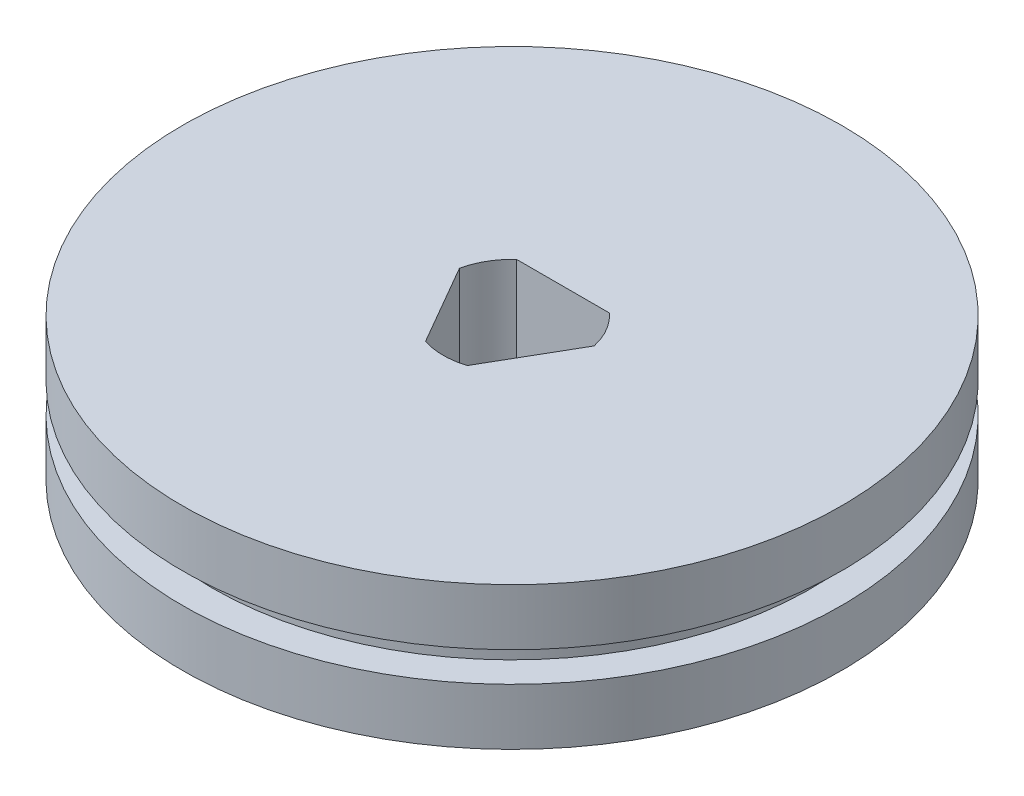
ISO-10303-21;
HEADER;
FILE_DESCRIPTION(('STEP AP214'),'2;1');
FILE_NAME('part.step','',(''),(''),'','','');
FILE_SCHEMA(('AUTOMOTIVE_DESIGN { 1 0 10303 214 1 1 1 1 }'));
ENDSEC;
DATA;
#1=APPLICATION_CONTEXT('core data for automotive mechanical design processes');
#2=APPLICATION_PROTOCOL_DEFINITION('international standard','automotive_design',2000,#1);
#3=PRODUCT_CONTEXT('',#1,'mechanical');
#4=PRODUCT('Part','Part','',(#3));
#5=PRODUCT_RELATED_PRODUCT_CATEGORY('part','',(#4));
#6=PRODUCT_DEFINITION_FORMATION('','',#4);
#7=PRODUCT_DEFINITION_CONTEXT('part definition',#1,'design');
#8=PRODUCT_DEFINITION('design','',#6,#7);
#9=PRODUCT_DEFINITION_SHAPE('','',#8);
#10=(LENGTH_UNIT() NAMED_UNIT(*) SI_UNIT(.MILLI.,.METRE.));
#11=(NAMED_UNIT(*) PLANE_ANGLE_UNIT() SI_UNIT($,.RADIAN.));
#12=(NAMED_UNIT(*) SI_UNIT($,.STERADIAN.) SOLID_ANGLE_UNIT());
#13=UNCERTAINTY_MEASURE_WITH_UNIT(LENGTH_MEASURE(1.E-05),#10,'distance_accuracy_value','');
#14=(GEOMETRIC_REPRESENTATION_CONTEXT(3) GLOBAL_UNCERTAINTY_ASSIGNED_CONTEXT((#13)) GLOBAL_UNIT_ASSIGNED_CONTEXT((#10,
#11,#12)) REPRESENTATION_CONTEXT('',''));
#15=CARTESIAN_POINT('',(0.,0.,0.));
#16=DIRECTION('',(0.,0.,1.));
#17=DIRECTION('',(1.,0.,0.));
#18=AXIS2_PLACEMENT_3D('',#15,#16,#17);
#19=CARTESIAN_POINT('',(0.,2.38125,0.));
#20=DIRECTION('',(0.,-1.,0.));
#21=DIRECTION('',(0.,0.,-1.));
#22=AXIS2_PLACEMENT_3D('',#19,#20,#21);
#23=CYLINDRICAL_SURFACE('',#22,11.);
#24=CARTESIAN_POINT('',(0.,-2.38125,0.));
#25=DIRECTION('',(0.,1.,0.));
#26=DIRECTION('',(0.,0.,1.));
#27=AXIS2_PLACEMENT_3D('',#24,#25,#26);
#28=CIRCLE('',#27,11.);
#29=CARTESIAN_POINT('',(0.,-2.38125,-11.));
#30=VERTEX_POINT('',#29);
#31=EDGE_CURVE('E41',#30,#30,#28,.T.);
#32=CARTESIAN_POINT('',(0.,-0.5,0.));
#33=DIRECTION('',(0.,1.,0.));
#34=DIRECTION('',(0.,0.,1.));
#35=AXIS2_PLACEMENT_3D('',#32,#33,#34);
#36=CIRCLE('',#35,11.);
#37=CARTESIAN_POINT('',(0.,-0.5,-11.));
#38=VERTEX_POINT('',#37);
#39=EDGE_CURVE('E149',#38,#38,#36,.T.);
#40=CARTESIAN_POINT('',(0.,-2.38125,-11.));
#41=CARTESIAN_POINT('',(0.,-2.36165364583333,-11.));
#42=CARTESIAN_POINT('',(0.,-2.34205729166667,-11.));
#43=CARTESIAN_POINT('',(0.,-2.30286458333333,-11.));
#44=CARTESIAN_POINT('',(0.,-2.28326822916667,-11.));
#45=CARTESIAN_POINT('',(0.,-2.24407552083333,-11.));
#46=CARTESIAN_POINT('',(0.,-2.22447916666667,-11.));
#47=CARTESIAN_POINT('',(0.,-2.18528645833333,-11.));
#48=CARTESIAN_POINT('',(0.,-2.16569010416667,-11.));
#49=CARTESIAN_POINT('',(0.,-2.12649739583333,-11.));
#50=CARTESIAN_POINT('',(0.,-2.10690104166667,-11.));
#51=CARTESIAN_POINT('',(0.,-2.06770833333333,-11.));
#52=CARTESIAN_POINT('',(0.,-2.04811197916667,-11.));
#53=CARTESIAN_POINT('',(0.,-2.00891927083333,-11.));
#54=CARTESIAN_POINT('',(0.,-1.98932291666667,-11.));
#55=CARTESIAN_POINT('',(0.,-1.95013020833333,-11.));
#56=CARTESIAN_POINT('',(0.,-1.93053385416667,-11.));
#57=CARTESIAN_POINT('',(0.,-1.89134114583333,-11.));
#58=CARTESIAN_POINT('',(0.,-1.87174479166667,-11.));
#59=CARTESIAN_POINT('',(0.,-1.83255208333333,-11.));
#60=CARTESIAN_POINT('',(0.,-1.81295572916667,-11.));
#61=CARTESIAN_POINT('',(0.,-1.77376302083333,-11.));
#62=CARTESIAN_POINT('',(0.,-1.75416666666667,-11.));
#63=CARTESIAN_POINT('',(0.,-1.71497395833333,-11.));
#64=CARTESIAN_POINT('',(0.,-1.69537760416667,-11.));
#65=CARTESIAN_POINT('',(0.,-1.65618489583333,-11.));
#66=CARTESIAN_POINT('',(0.,-1.63658854166667,-11.));
#67=CARTESIAN_POINT('',(0.,-1.59739583333333,-11.));
#68=CARTESIAN_POINT('',(0.,-1.57779947916667,-11.));
#69=CARTESIAN_POINT('',(0.,-1.53860677083333,-11.));
#70=CARTESIAN_POINT('',(0.,-1.51901041666667,-11.));
#71=CARTESIAN_POINT('',(0.,-1.47981770833333,-11.));
#72=CARTESIAN_POINT('',(0.,-1.46022135416667,-11.));
#73=CARTESIAN_POINT('',(0.,-1.42102864583333,-11.));
#74=CARTESIAN_POINT('',(0.,-1.40143229166667,-11.));
#75=CARTESIAN_POINT('',(0.,-1.36223958333333,-11.));
#76=CARTESIAN_POINT('',(0.,-1.34264322916667,-11.));
#77=CARTESIAN_POINT('',(0.,-1.30345052083333,-11.));
#78=CARTESIAN_POINT('',(0.,-1.28385416666667,-11.));
#79=CARTESIAN_POINT('',(0.,-1.24466145833333,-11.));
#80=CARTESIAN_POINT('',(0.,-1.22506510416667,-11.));
#81=CARTESIAN_POINT('',(0.,-1.18587239583333,-11.));
#82=CARTESIAN_POINT('',(0.,-1.16627604166667,-11.));
#83=CARTESIAN_POINT('',(0.,-1.12708333333333,-11.));
#84=CARTESIAN_POINT('',(0.,-1.10748697916667,-11.));
#85=CARTESIAN_POINT('',(0.,-1.06829427083333,-11.));
#86=CARTESIAN_POINT('',(0.,-1.04869791666667,-11.));
#87=CARTESIAN_POINT('',(0.,-1.00950520833333,-11.));
#88=CARTESIAN_POINT('',(0.,-0.989908854166667,-11.));
#89=CARTESIAN_POINT('',(0.,-0.950716145833334,-11.));
#90=CARTESIAN_POINT('',(0.,-0.931119791666667,-11.));
#91=CARTESIAN_POINT('',(0.,-0.891927083333334,-11.));
#92=CARTESIAN_POINT('',(0.,-0.872330729166667,-11.));
#93=CARTESIAN_POINT('',(0.,-0.833138020833334,-11.));
#94=CARTESIAN_POINT('',(0.,-0.813541666666667,-11.));
#95=CARTESIAN_POINT('',(0.,-0.774348958333334,-11.));
#96=CARTESIAN_POINT('',(0.,-0.754752604166667,-11.));
#97=CARTESIAN_POINT('',(0.,-0.715559895833334,-11.));
#98=CARTESIAN_POINT('',(0.,-0.695963541666667,-11.));
#99=CARTESIAN_POINT('',(0.,-0.656770833333334,-11.));
#100=CARTESIAN_POINT('',(0.,-0.637174479166667,-11.));
#101=CARTESIAN_POINT('',(0.,-0.597981770833334,-11.));
#102=CARTESIAN_POINT('',(0.,-0.578385416666667,-11.));
#103=CARTESIAN_POINT('',(0.,-0.539192708333334,-11.));
#104=CARTESIAN_POINT('',(0.,-0.519596354166667,-11.));
#105=CARTESIAN_POINT('',(0.,-0.5,-11.));
#106=B_SPLINE_CURVE_WITH_KNOTS('',3,(#40,#41,#42,#43,#44,#45,#46,#47,#48,#49,#50,#51,#52,#53,
#54,#55,#56,#57,#58,#59,#60,#61,#62,#63,#64,#65,#66,#67,#68,#69,#70,#71,#72,#73,#74,#75,#76,#77,
#78,#79,#80,#81,#82,#83,#84,#85,#86,#87,#88,#89,#90,#91,#92,#93,#94,#95,#96,#97,#98,#99,#100,
#101,#102,#103,#104,#105),.UNSPECIFIED.,.F.,.F.,(4,2,2,2,2,2,2,2,2,2,2,2,2,2,2,2,2,2,2,2,2,2,2,
2,2,2,2,2,2,2,2,2,4),(0.,0.0587890625,0.117578125,0.1763671875,0.23515625,0.2939453125,
0.352734375,0.4115234375,0.4703125,0.5291015625,0.587890625,0.6466796875,0.70546875,
0.7642578125,0.823046875,0.8818359375,0.940625,0.9994140625,1.058203125,1.1169921875,1.17578125,
1.2345703125,1.293359375,1.3521484375,1.4109375,1.4697265625,1.528515625,1.5873046875,
1.64609375,1.7048828125,1.763671875,1.8224609375,1.88125),.UNSPECIFIED.);
#107=EDGE_CURVE('BSEAM37',#30,#38,#106,.T.);
#108=ORIENTED_EDGE('',*,*,#31,.T.);
#109=ORIENTED_EDGE('',*,*,#39,.F.);
#110=ORIENTED_EDGE('',*,*,#107,.T.);
#111=ORIENTED_EDGE('',*,*,#107,.F.);
#112=EDGE_LOOP('',(#108,#110,#109,#111));
#113=FACE_BOUND('',#112,.T.);
#114=ADVANCED_FACE('F37',(#113),#23,.T.);
#115=CARTESIAN_POINT('',(0.,-2.38125,0.));
#116=DIRECTION('',(0.,1.,0.));
#117=DIRECTION('',(0.,0.,1.));
#118=AXIS2_PLACEMENT_3D('',#115,#116,#117);
#119=PLANE('',#118);
#120=DIRECTION('',(-1.,0.,0.));
#121=VECTOR('',#120,1.);
#122=CARTESIAN_POINT('',(1.54919333848297,-2.38125,-1.7));
#123=LINE('',#122,#121);
#124=CARTESIAN_POINT('',(1.54919333848297,-2.38125,-1.7));
#125=VERTEX_POINT('',#124);
#126=CARTESIAN_POINT('',(-1.54919333848297,-2.38125,-1.7));
#127=VERTEX_POINT('',#126);
#128=EDGE_CURVE('E98',#125,#127,#123,.T.);
#129=ORIENTED_EDGE('',*,*,#128,.T.);
#130=CARTESIAN_POINT('',(0.,-2.38125,0.));
#131=DIRECTION('',(0.,1.,0.));
#132=DIRECTION('',(0.,0.,1.));
#133=AXIS2_PLACEMENT_3D('',#130,#131,#132);
#134=CIRCLE('',#133,2.3);
#135=CARTESIAN_POINT('',(-2.24683985567503,-2.38125,-0.491640786499874));
#136=VERTEX_POINT('',#135);
#137=EDGE_CURVE('E92',#127,#136,#134,.T.);
#138=ORIENTED_EDGE('',*,*,#137,.T.);
#139=DIRECTION('',(0.5,0.,0.866025403784439));
#140=VECTOR('',#139,1.);
#141=CARTESIAN_POINT('',(-2.24683985567503,-2.38125,-0.491640786499874));
#142=LINE('',#141,#140);
#143=CARTESIAN_POINT('',(-0.697646517192063,-2.38125,2.19164078649987));
#144=VERTEX_POINT('',#143);
#145=EDGE_CURVE('E101',#136,#144,#142,.T.);
#146=ORIENTED_EDGE('',*,*,#145,.T.);
#147=CARTESIAN_POINT('',(0.,-2.38125,0.));
#148=DIRECTION('',(0.,1.,0.));
#149=DIRECTION('',(0.,0.,1.));
#150=AXIS2_PLACEMENT_3D('',#147,#148,#149);
#151=CIRCLE('',#150,2.3);
#152=CARTESIAN_POINT('',(0.697646517192063,-2.38125,2.19164078649987));
#153=VERTEX_POINT('',#152);
#154=EDGE_CURVE('E52',#144,#153,#151,.T.);
#155=ORIENTED_EDGE('',*,*,#154,.T.);
#156=DIRECTION('',(0.500000000000001,0.,-0.866025403784438));
#157=VECTOR('',#156,1.);
#158=CARTESIAN_POINT('',(0.697646517192063,-2.38125,2.19164078649987));
#159=LINE('',#158,#157);
#160=CARTESIAN_POINT('',(2.24683985567503,-2.38125,-0.491640786499873));
#161=VERTEX_POINT('',#160);
#162=EDGE_CURVE('E116',#153,#161,#159,.T.);
#163=ORIENTED_EDGE('',*,*,#162,.T.);
#164=CARTESIAN_POINT('',(0.,-2.38125,0.));
#165=DIRECTION('',(0.,1.,0.));
#166=DIRECTION('',(0.,0.,-1.));
#167=AXIS2_PLACEMENT_3D('',#164,#165,#166);
#168=CIRCLE('',#167,2.3);
#169=EDGE_CURVE('E119',#161,#125,#168,.T.);
#170=ORIENTED_EDGE('',*,*,#169,.T.);
#171=EDGE_LOOP('',(#129,#138,#146,#155,#163,#170));
#172=FACE_BOUND('',#171,.T.);
#173=ORIENTED_EDGE('',*,*,#31,.F.);
#174=EDGE_LOOP('',(#173));
#175=FACE_BOUND('',#174,.T.);
#176=ADVANCED_FACE('F105',(#172,#175),#119,.F.);
#177=CARTESIAN_POINT('',(0.,-0.5,0.));
#178=DIRECTION('',(0.,1.,0.));
#179=DIRECTION('',(0.,0.,1.));
#180=AXIS2_PLACEMENT_3D('',#177,#178,#179);
#181=PLANE('',#180);
#182=CARTESIAN_POINT('',(0.,-0.5,0.));
#183=DIRECTION('',(0.,1.,0.));
#184=DIRECTION('',(0.,0.,1.));
#185=AXIS2_PLACEMENT_3D('',#182,#183,#184);
#186=CIRCLE('',#185,10.);
#187=CARTESIAN_POINT('',(0.,-0.5,10.));
#188=VERTEX_POINT('',#187);
#189=EDGE_CURVE('E143',#188,#188,#186,.T.);
#190=ORIENTED_EDGE('',*,*,#189,.F.);
#191=EDGE_LOOP('',(#190));
#192=FACE_BOUND('',#191,.T.);
#193=ORIENTED_EDGE('',*,*,#39,.T.);
#194=EDGE_LOOP('',(#193));
#195=FACE_BOUND('',#194,.T.);
#196=ADVANCED_FACE('F160',(#192,#195),#181,.T.);
#197=CARTESIAN_POINT('',(0.,0.5,0.));
#198=DIRECTION('',(0.,1.,0.));
#199=DIRECTION('',(0.,0.,1.));
#200=AXIS2_PLACEMENT_3D('',#197,#198,#199);
#201=PLANE('',#200);
#202=CARTESIAN_POINT('',(0.,0.5,0.));
#203=DIRECTION('',(0.,1.,0.));
#204=DIRECTION('',(0.,0.,1.));
#205=AXIS2_PLACEMENT_3D('',#202,#203,#204);
#206=CIRCLE('',#205,10.);
#207=CARTESIAN_POINT('',(0.,0.5,10.));
#208=VERTEX_POINT('',#207);
#209=EDGE_CURVE('E135',#208,#208,#206,.T.);
#210=ORIENTED_EDGE('',*,*,#209,.T.);
#211=EDGE_LOOP('',(#210));
#212=FACE_BOUND('',#211,.T.);
#213=CARTESIAN_POINT('',(0.,0.5,0.));
#214=DIRECTION('',(0.,1.,0.));
#215=DIRECTION('',(0.,0.,1.));
#216=AXIS2_PLACEMENT_3D('',#213,#214,#215);
#217=CIRCLE('',#216,11.);
#218=CARTESIAN_POINT('',(0.,0.5,-11.));
#219=VERTEX_POINT('',#218);
#220=EDGE_CURVE('E146',#219,#219,#217,.T.);
#221=ORIENTED_EDGE('',*,*,#220,.F.);
#222=EDGE_LOOP('',(#221));
#223=FACE_BOUND('',#222,.T.);
#224=ADVANCED_FACE('F157',(#212,#223),#201,.F.);
#225=CARTESIAN_POINT('',(0.,-0.5,0.));
#226=DIRECTION('',(0.,1.,0.));
#227=DIRECTION('',(0.,0.,1.));
#228=AXIS2_PLACEMENT_3D('',#225,#226,#227);
#229=CYLINDRICAL_SURFACE('',#228,10.);
#230=ORIENTED_EDGE('',*,*,#189,.T.);
#231=EDGE_LOOP('',(#230));
#232=FACE_BOUND('',#231,.T.);
#233=ORIENTED_EDGE('',*,*,#209,.F.);
#234=EDGE_LOOP('',(#233));
#235=FACE_BOUND('',#234,.T.);
#236=ADVANCED_FACE('F159',(#232,#235),#229,.T.);
#237=CARTESIAN_POINT('',(0.,2.38125,0.));
#238=DIRECTION('',(0.,1.,0.));
#239=DIRECTION('',(0.,0.,1.));
#240=AXIS2_PLACEMENT_3D('',#237,#238,#239);
#241=PLANE('',#240);
#242=CARTESIAN_POINT('',(0.,2.38125,0.));
#243=DIRECTION('',(0.,1.,0.));
#244=DIRECTION('',(0.,0.,1.));
#245=AXIS2_PLACEMENT_3D('',#242,#243,#244);
#246=CIRCLE('',#245,2.3);
#247=CARTESIAN_POINT('',(-1.54919333848297,2.38125,-1.7));
#248=VERTEX_POINT('',#247);
#249=CARTESIAN_POINT('',(-2.24683985567503,2.38125,-0.491640786499874));
#250=VERTEX_POINT('',#249);
#251=EDGE_CURVE('E60',#248,#250,#246,.T.);
#252=ORIENTED_EDGE('',*,*,#251,.F.);
#253=DIRECTION('',(-1.,0.,0.));
#254=VECTOR('',#253,1.);
#255=CARTESIAN_POINT('',(1.54919333848297,2.38125,-1.7));
#256=LINE('',#255,#254);
#257=CARTESIAN_POINT('',(1.54919333848297,2.38125,-1.7));
#258=VERTEX_POINT('',#257);
#259=EDGE_CURVE('E109',#258,#248,#256,.T.);
#260=ORIENTED_EDGE('',*,*,#259,.F.);
#261=CARTESIAN_POINT('',(0.,2.38125,0.));
#262=DIRECTION('',(0.,1.,0.));
#263=DIRECTION('',(0.,0.,-1.));
#264=AXIS2_PLACEMENT_3D('',#261,#262,#263);
#265=CIRCLE('',#264,2.3);
#266=CARTESIAN_POINT('',(2.24683985567503,2.38125,-0.491640786499873));
#267=VERTEX_POINT('',#266);
#268=EDGE_CURVE('E112',#267,#258,#265,.T.);
#269=ORIENTED_EDGE('',*,*,#268,.F.);
#270=DIRECTION('',(0.500000000000001,0.,-0.866025403784438));
#271=VECTOR('',#270,1.);
#272=CARTESIAN_POINT('',(0.697646517192063,2.38125,2.19164078649987));
#273=LINE('',#272,#271);
#274=CARTESIAN_POINT('',(0.697646517192063,2.38125,2.19164078649987));
#275=VERTEX_POINT('',#274);
#276=EDGE_CURVE('E128',#275,#267,#273,.T.);
#277=ORIENTED_EDGE('',*,*,#276,.F.);
#278=CARTESIAN_POINT('',(0.,2.38125,0.));
#279=DIRECTION('',(0.,1.,0.));
#280=DIRECTION('',(0.,0.,1.));
#281=AXIS2_PLACEMENT_3D('',#278,#279,#280);
#282=CIRCLE('',#281,2.3);
#283=CARTESIAN_POINT('',(-0.697646517192063,2.38125,2.19164078649987));
#284=VERTEX_POINT('',#283);
#285=EDGE_CURVE('E125',#284,#275,#282,.T.);
#286=ORIENTED_EDGE('',*,*,#285,.F.);
#287=DIRECTION('',(0.5,0.,0.866025403784439));
#288=VECTOR('',#287,1.);
#289=CARTESIAN_POINT('',(-2.24683985567503,2.38125,-0.491640786499874));
#290=LINE('',#289,#288);
#291=EDGE_CURVE('E123',#250,#284,#290,.T.);
#292=ORIENTED_EDGE('',*,*,#291,.F.);
#293=EDGE_LOOP('',(#252,#260,#269,#277,#286,#292));
#294=FACE_BOUND('',#293,.T.);
#295=CARTESIAN_POINT('',(0.,2.38125,0.));
#296=DIRECTION('',(0.,1.,0.));
#297=DIRECTION('',(0.,0.,1.));
#298=AXIS2_PLACEMENT_3D('',#295,#296,#297);
#299=CIRCLE('',#298,11.);
#300=CARTESIAN_POINT('',(0.,2.38125,-11.));
#301=VERTEX_POINT('',#300);
#302=EDGE_CURVE('E11',#301,#301,#299,.T.);
#303=ORIENTED_EDGE('',*,*,#302,.T.);
#304=EDGE_LOOP('',(#303));
#305=FACE_BOUND('',#304,.T.);
#306=ADVANCED_FACE('F167',(#294,#305),#241,.T.);
#307=CARTESIAN_POINT('',(0.,0.5,-11.));
#308=CARTESIAN_POINT('',(0.,0.519596354166666,-11.));
#309=CARTESIAN_POINT('',(0.,0.539192708333333,-11.));
#310=CARTESIAN_POINT('',(0.,0.578385416666667,-11.));
#311=CARTESIAN_POINT('',(0.,0.597981770833333,-11.));
#312=CARTESIAN_POINT('',(0.,0.637174479166667,-11.));
#313=CARTESIAN_POINT('',(0.,0.656770833333333,-11.));
#314=CARTESIAN_POINT('',(0.,0.695963541666667,-11.));
#315=CARTESIAN_POINT('',(0.,0.715559895833333,-11.));
#316=CARTESIAN_POINT('',(0.,0.754752604166667,-11.));
#317=CARTESIAN_POINT('',(0.,0.774348958333333,-11.));
#318=CARTESIAN_POINT('',(0.,0.813541666666667,-11.));
#319=CARTESIAN_POINT('',(0.,0.833138020833333,-11.));
#320=CARTESIAN_POINT('',(0.,0.872330729166667,-11.));
#321=CARTESIAN_POINT('',(0.,0.891927083333333,-11.));
#322=CARTESIAN_POINT('',(0.,0.931119791666666,-11.));
#323=CARTESIAN_POINT('',(0.,0.950716145833333,-11.));
#324=CARTESIAN_POINT('',(0.,0.989908854166667,-11.));
#325=CARTESIAN_POINT('',(0.,1.00950520833333,-11.));
#326=CARTESIAN_POINT('',(0.,1.04869791666667,-11.));
#327=CARTESIAN_POINT('',(0.,1.06829427083333,-11.));
#328=CARTESIAN_POINT('',(0.,1.10748697916667,-11.));
#329=CARTESIAN_POINT('',(0.,1.12708333333333,-11.));
#330=CARTESIAN_POINT('',(0.,1.16627604166667,-11.));
#331=CARTESIAN_POINT('',(0.,1.18587239583333,-11.));
#332=CARTESIAN_POINT('',(0.,1.22506510416667,-11.));
#333=CARTESIAN_POINT('',(0.,1.24466145833333,-11.));
#334=CARTESIAN_POINT('',(0.,1.28385416666667,-11.));
#335=CARTESIAN_POINT('',(0.,1.30345052083333,-11.));
#336=CARTESIAN_POINT('',(0.,1.34264322916667,-11.));
#337=CARTESIAN_POINT('',(0.,1.36223958333333,-11.));
#338=CARTESIAN_POINT('',(0.,1.40143229166667,-11.));
#339=CARTESIAN_POINT('',(0.,1.42102864583333,-11.));
#340=CARTESIAN_POINT('',(0.,1.46022135416667,-11.));
#341=CARTESIAN_POINT('',(0.,1.47981770833333,-11.));
#342=CARTESIAN_POINT('',(0.,1.51901041666667,-11.));
#343=CARTESIAN_POINT('',(0.,1.53860677083333,-11.));
#344=CARTESIAN_POINT('',(0.,1.57779947916667,-11.));
#345=CARTESIAN_POINT('',(0.,1.59739583333333,-11.));
#346=CARTESIAN_POINT('',(0.,1.63658854166667,-11.));
#347=CARTESIAN_POINT('',(0.,1.65618489583333,-11.));
#348=CARTESIAN_POINT('',(0.,1.69537760416667,-11.));
#349=CARTESIAN_POINT('',(0.,1.71497395833333,-11.));
#350=CARTESIAN_POINT('',(0.,1.75416666666667,-11.));
#351=CARTESIAN_POINT('',(0.,1.77376302083333,-11.));
#352=CARTESIAN_POINT('',(0.,1.81295572916667,-11.));
#353=CARTESIAN_POINT('',(0.,1.83255208333333,-11.));
#354=CARTESIAN_POINT('',(0.,1.87174479166667,-11.));
#355=CARTESIAN_POINT('',(0.,1.89134114583333,-11.));
#356=CARTESIAN_POINT('',(0.,1.93053385416667,-11.));
#357=CARTESIAN_POINT('',(0.,1.95013020833333,-11.));
#358=CARTESIAN_POINT('',(0.,1.98932291666667,-11.));
#359=CARTESIAN_POINT('',(0.,2.00891927083333,-11.));
#360=CARTESIAN_POINT('',(0.,2.04811197916667,-11.));
#361=CARTESIAN_POINT('',(0.,2.06770833333333,-11.));
#362=CARTESIAN_POINT('',(0.,2.10690104166667,-11.));
#363=CARTESIAN_POINT('',(0.,2.12649739583333,-11.));
#364=CARTESIAN_POINT('',(0.,2.16569010416667,-11.));
#365=CARTESIAN_POINT('',(0.,2.18528645833333,-11.));
#366=CARTESIAN_POINT('',(0.,2.22447916666667,-11.));
#367=CARTESIAN_POINT('',(0.,2.24407552083333,-11.));
#368=CARTESIAN_POINT('',(0.,2.28326822916667,-11.));
#369=CARTESIAN_POINT('',(0.,2.30286458333333,-11.));
#370=CARTESIAN_POINT('',(0.,2.34205729166667,-11.));
#371=CARTESIAN_POINT('',(0.,2.36165364583333,-11.));
#372=CARTESIAN_POINT('',(0.,2.38125,-11.));
#373=B_SPLINE_CURVE_WITH_KNOTS('',3,(#307,#308,#309,#310,#311,#312,#313,#314,#315,#316,#317,
#318,#319,#320,#321,#322,#323,#324,#325,#326,#327,#328,#329,#330,#331,#332,#333,#334,#335,#336,
#337,#338,#339,#340,#341,#342,#343,#344,#345,#346,#347,#348,#349,#350,#351,#352,#353,#354,#355,
#356,#357,#358,#359,#360,#361,#362,#363,#364,#365,#366,#367,#368,#369,#370,#371,#372),
.UNSPECIFIED.,.F.,.F.,(4,2,2,2,2,2,2,2,2,2,2,2,2,2,2,2,2,2,2,2,2,2,2,2,2,2,2,2,2,2,2,2,4),(0.,
0.0587890625,0.117578125,0.1763671875,0.23515625,0.2939453125,0.352734375,0.4115234375,
0.4703125,0.5291015625,0.587890625,0.6466796875,0.70546875,0.7642578125,0.823046875,
0.8818359375,0.940625,0.9994140625,1.058203125,1.1169921875,1.17578125,1.2345703125,1.293359375,
1.3521484375,1.4109375,1.4697265625,1.528515625,1.5873046875,1.64609375,1.7048828125,
1.763671875,1.8224609375,1.88125),.UNSPECIFIED.);
#374=EDGE_CURVE('BSEAM39',#219,#301,#373,.T.);
#375=ORIENTED_EDGE('',*,*,#220,.T.);
#376=ORIENTED_EDGE('',*,*,#302,.F.);
#377=ORIENTED_EDGE('',*,*,#374,.T.);
#378=ORIENTED_EDGE('',*,*,#374,.F.);
#379=EDGE_LOOP('',(#375,#377,#376,#378));
#380=FACE_BOUND('',#379,.T.);
#381=ADVANCED_FACE('F39',(#380),#23,.T.);
#382=CARTESIAN_POINT('',(0.,-2.38125,0.));
#383=DIRECTION('',(0.,1.,0.));
#384=DIRECTION('',(0.,0.,1.));
#385=AXIS2_PLACEMENT_3D('',#382,#383,#384);
#386=CYLINDRICAL_SURFACE('',#385,2.3);
#387=ORIENTED_EDGE('',*,*,#251,.T.);
#388=DIRECTION('',(0.,1.,0.));
#389=VECTOR('',#388,1.);
#390=CARTESIAN_POINT('',(-2.24683985567503,-2.38125,-0.491640786499874));
#391=LINE('',#390,#389);
#392=EDGE_CURVE('E88',#136,#250,#391,.T.);
#393=ORIENTED_EDGE('',*,*,#392,.F.);
#394=ORIENTED_EDGE('',*,*,#137,.F.);
#395=DIRECTION('',(0.,1.,0.));
#396=VECTOR('',#395,1.);
#397=CARTESIAN_POINT('',(-1.54919333848297,-2.38125,-1.7));
#398=LINE('',#397,#396);
#399=EDGE_CURVE('E133',#127,#248,#398,.T.);
#400=ORIENTED_EDGE('',*,*,#399,.T.);
#401=EDGE_LOOP('',(#387,#393,#394,#400));
#402=FACE_BOUND('',#401,.T.);
#403=ADVANCED_FACE('F90',(#402),#386,.F.);
#404=CARTESIAN_POINT('',(1.54919333848297,-2.38125,-1.7));
#405=DIRECTION('',(0.,0.,-1.));
#406=DIRECTION('',(-1.,0.,0.));
#407=AXIS2_PLACEMENT_3D('',#404,#405,#406);
#408=PLANE('',#407);
#409=ORIENTED_EDGE('',*,*,#259,.T.);
#410=ORIENTED_EDGE('',*,*,#399,.F.);
#411=ORIENTED_EDGE('',*,*,#128,.F.);
#412=DIRECTION('',(0.,1.,0.));
#413=VECTOR('',#412,1.);
#414=CARTESIAN_POINT('',(1.54919333848297,-2.38125,-1.7));
#415=LINE('',#414,#413);
#416=EDGE_CURVE('E136',#125,#258,#415,.T.);
#417=ORIENTED_EDGE('',*,*,#416,.T.);
#418=EDGE_LOOP('',(#409,#410,#411,#417));
#419=FACE_BOUND('',#418,.T.);
#420=ADVANCED_FACE('F185',(#419),#408,.F.);
#421=CARTESIAN_POINT('',(0.,-2.38125,0.));
#422=DIRECTION('',(0.,1.,0.));
#423=DIRECTION('',(0.,0.,1.));
#424=AXIS2_PLACEMENT_3D('',#421,#422,#423);
#425=CYLINDRICAL_SURFACE('',#424,2.3);
#426=ORIENTED_EDGE('',*,*,#268,.T.);
#427=ORIENTED_EDGE('',*,*,#416,.F.);
#428=ORIENTED_EDGE('',*,*,#169,.F.);
#429=DIRECTION('',(0.,1.,0.));
#430=VECTOR('',#429,1.);
#431=CARTESIAN_POINT('',(2.24683985567503,-2.38125,-0.491640786499873));
#432=LINE('',#431,#430);
#433=EDGE_CURVE('E138',#161,#267,#432,.T.);
#434=ORIENTED_EDGE('',*,*,#433,.T.);
#435=EDGE_LOOP('',(#426,#427,#428,#434));
#436=FACE_BOUND('',#435,.T.);
#437=ADVANCED_FACE('F202',(#436),#425,.F.);
#438=CARTESIAN_POINT('',(0.697646517192063,-2.38125,2.19164078649987));
#439=DIRECTION('',(0.866025403784438,0.,0.500000000000001));
#440=DIRECTION('',(0.500000000000001,0.,-0.866025403784438));
#441=AXIS2_PLACEMENT_3D('',#438,#439,#440);
#442=PLANE('',#441);
#443=ORIENTED_EDGE('',*,*,#276,.T.);
#444=ORIENTED_EDGE('',*,*,#433,.F.);
#445=ORIENTED_EDGE('',*,*,#162,.F.);
#446=DIRECTION('',(0.,1.,0.));
#447=VECTOR('',#446,1.);
#448=CARTESIAN_POINT('',(0.697646517192063,-2.38125,2.19164078649987));
#449=LINE('',#448,#447);
#450=EDGE_CURVE('E140',#153,#275,#449,.T.);
#451=ORIENTED_EDGE('',*,*,#450,.T.);
#452=EDGE_LOOP('',(#443,#444,#445,#451));
#453=FACE_BOUND('',#452,.T.);
#454=ADVANCED_FACE('F199',(#453),#442,.F.);
#455=CARTESIAN_POINT('',(0.,-2.38125,0.));
#456=DIRECTION('',(0.,1.,0.));
#457=DIRECTION('',(0.,0.,1.));
#458=AXIS2_PLACEMENT_3D('',#455,#456,#457);
#459=CYLINDRICAL_SURFACE('',#458,2.3);
#460=ORIENTED_EDGE('',*,*,#285,.T.);
#461=ORIENTED_EDGE('',*,*,#450,.F.);
#462=ORIENTED_EDGE('',*,*,#154,.F.);
#463=DIRECTION('',(0.,1.,0.));
#464=VECTOR('',#463,1.);
#465=CARTESIAN_POINT('',(-0.697646517192063,-2.38125,2.19164078649987));
#466=LINE('',#465,#464);
#467=EDGE_CURVE('E97',#144,#284,#466,.T.);
#468=ORIENTED_EDGE('',*,*,#467,.T.);
#469=EDGE_LOOP('',(#460,#461,#462,#468));
#470=FACE_BOUND('',#469,.T.);
#471=ADVANCED_FACE('F196',(#470),#459,.F.);
#472=CARTESIAN_POINT('',(-2.24683985567503,-2.38125,-0.491640786499874));
#473=DIRECTION('',(-0.866025403784439,0.,0.5));
#474=DIRECTION('',(0.5,0.,0.866025403784439));
#475=AXIS2_PLACEMENT_3D('',#472,#473,#474);
#476=PLANE('',#475);
#477=ORIENTED_EDGE('',*,*,#291,.T.);
#478=ORIENTED_EDGE('',*,*,#467,.F.);
#479=ORIENTED_EDGE('',*,*,#145,.F.);
#480=ORIENTED_EDGE('',*,*,#392,.T.);
#481=EDGE_LOOP('',(#477,#478,#479,#480));
#482=FACE_BOUND('',#481,.T.);
#483=ADVANCED_FACE('F102',(#482),#476,.F.);
#484=CLOSED_SHELL('',(#114,#176,#196,#224,#236,#306,#381,#403,#420,#437,#454,#471,#483));
#485=MANIFOLD_SOLID_BREP('B2',#484);
#486=ADVANCED_BREP_SHAPE_REPRESENTATION('',(#18,#485),#14);
#487=SHAPE_DEFINITION_REPRESENTATION(#9,#486);
ENDSEC;
END-ISO-10303-21;
